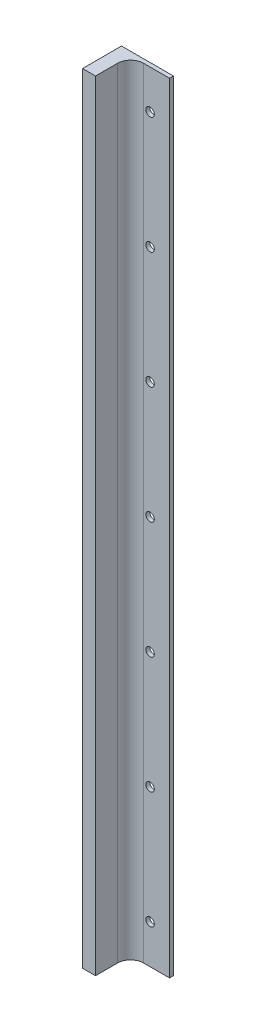
ISO-10303-21;
HEADER;
FILE_DESCRIPTION(('STEP AP214'),'2;1');
FILE_NAME('part.step','',(''),(''),'','','');
FILE_SCHEMA(('AUTOMOTIVE_DESIGN { 1 0 10303 214 1 1 1 1 }'));
ENDSEC;
DATA;
#1=APPLICATION_CONTEXT('core data for automotive mechanical design processes');
#2=APPLICATION_PROTOCOL_DEFINITION('international standard','automotive_design',2000,#1);
#3=PRODUCT_CONTEXT('',#1,'mechanical');
#4=PRODUCT('Part','Part','',(#3));
#5=PRODUCT_RELATED_PRODUCT_CATEGORY('part','',(#4));
#6=PRODUCT_DEFINITION_FORMATION('','',#4);
#7=PRODUCT_DEFINITION_CONTEXT('part definition',#1,'design');
#8=PRODUCT_DEFINITION('design','',#6,#7);
#9=PRODUCT_DEFINITION_SHAPE('','',#8);
#10=(LENGTH_UNIT() NAMED_UNIT(*) SI_UNIT(.MILLI.,.METRE.));
#11=(NAMED_UNIT(*) PLANE_ANGLE_UNIT() SI_UNIT($,.RADIAN.));
#12=(NAMED_UNIT(*) SI_UNIT($,.STERADIAN.) SOLID_ANGLE_UNIT());
#13=UNCERTAINTY_MEASURE_WITH_UNIT(LENGTH_MEASURE(1.E-05),#10,'distance_accuracy_value','');
#14=(GEOMETRIC_REPRESENTATION_CONTEXT(3) GLOBAL_UNCERTAINTY_ASSIGNED_CONTEXT((#13)) GLOBAL_UNIT_ASSIGNED_CONTEXT((#10,
#11,#12)) REPRESENTATION_CONTEXT('',''));
#15=CARTESIAN_POINT('',(0.,0.,0.));
#16=DIRECTION('',(0.,0.,1.));
#17=DIRECTION('',(1.,0.,0.));
#18=AXIS2_PLACEMENT_3D('',#15,#16,#17);
#19=CARTESIAN_POINT('',(0.,0.,3.));
#20=DIRECTION('',(0.,0.,1.));
#21=DIRECTION('',(1.,0.,0.));
#22=AXIS2_PLACEMENT_3D('',#19,#20,#21);
#23=PLANE('',#22);
#24=DIRECTION('',(-1.,0.,0.));
#25=VECTOR('',#24,1.);
#26=CARTESIAN_POINT('',(165.,300.,3.));
#27=LINE('',#26,#25);
#28=CARTESIAN_POINT('',(165.,300.,3.));
#29=VERTEX_POINT('',#28);
#30=CARTESIAN_POINT('',(145.,300.,3.));
#31=VERTEX_POINT('',#30);
#32=EDGE_CURVE('E168',#29,#31,#27,.T.);
#33=ORIENTED_EDGE('',*,*,#32,.T.);
#34=DIRECTION('',(0.,1.,0.));
#35=VECTOR('',#34,1.);
#36=CARTESIAN_POINT('',(145.,0.,3.));
#37=LINE('',#36,#35);
#38=CARTESIAN_POINT('',(145.,-300.,3.));
#39=VERTEX_POINT('',#38);
#40=EDGE_CURVE('E54',#31,#39,#37,.F.);
#41=ORIENTED_EDGE('',*,*,#40,.T.);
#42=DIRECTION('',(1.,0.,0.));
#43=VECTOR('',#42,1.);
#44=CARTESIAN_POINT('',(150.,-300.,3.));
#45=LINE('',#44,#43);
#46=CARTESIAN_POINT('',(165.,-300.,3.));
#47=VERTEX_POINT('',#46);
#48=EDGE_CURVE('E163',#39,#47,#45,.T.);
#49=ORIENTED_EDGE('',*,*,#48,.T.);
#50=DIRECTION('',(0.,1.,0.));
#51=VECTOR('',#50,1.);
#52=CARTESIAN_POINT('',(165.,-300.,3.));
#53=LINE('',#52,#51);
#54=EDGE_CURVE('E165',#47,#29,#53,.T.);
#55=ORIENTED_EDGE('',*,*,#54,.T.);
#56=EDGE_LOOP('',(#33,#41,#49,#55));
#57=FACE_BOUND('',#56,.T.);
#58=CARTESIAN_POINT('',(149.999999999999,-180.,3.));
#59=DIRECTION('',(0.,0.,1.));
#60=DIRECTION('',(1.,0.,0.));
#61=AXIS2_PLACEMENT_3D('',#58,#59,#60);
#62=CIRCLE('',#61,3.25000000000001);
#63=CARTESIAN_POINT('',(153.249999999999,-180.,3.));
#64=VERTEX_POINT('',#63);
#65=EDGE_CURVE('E127',#64,#64,#62,.T.);
#66=ORIENTED_EDGE('',*,*,#65,.F.);
#67=EDGE_LOOP('',(#66));
#68=FACE_BOUND('',#67,.T.);
#69=CARTESIAN_POINT('',(149.999999999998,0.,3.));
#70=DIRECTION('',(0.,0.,1.));
#71=DIRECTION('',(1.,0.,0.));
#72=AXIS2_PLACEMENT_3D('',#69,#70,#71);
#73=CIRCLE('',#72,3.25000000000001);
#74=CARTESIAN_POINT('',(153.249999999998,0.,3.));
#75=VERTEX_POINT('',#74);
#76=EDGE_CURVE('E139',#75,#75,#73,.T.);
#77=ORIENTED_EDGE('',*,*,#76,.F.);
#78=EDGE_LOOP('',(#77));
#79=FACE_BOUND('',#78,.T.);
#80=CARTESIAN_POINT('',(149.999999999998,180.,3.));
#81=DIRECTION('',(0.,0.,1.));
#82=DIRECTION('',(1.,0.,0.));
#83=AXIS2_PLACEMENT_3D('',#80,#81,#82);
#84=CIRCLE('',#83,3.25000000000001);
#85=CARTESIAN_POINT('',(153.249999999998,180.,3.));
#86=VERTEX_POINT('',#85);
#87=EDGE_CURVE('E151',#86,#86,#84,.T.);
#88=ORIENTED_EDGE('',*,*,#87,.F.);
#89=EDGE_LOOP('',(#88));
#90=FACE_BOUND('',#89,.T.);
#91=CARTESIAN_POINT('',(149.999999999998,270.,3.));
#92=DIRECTION('',(0.,0.,1.));
#93=DIRECTION('',(1.,0.,0.));
#94=AXIS2_PLACEMENT_3D('',#91,#92,#93);
#95=CIRCLE('',#94,3.25000000000001);
#96=CARTESIAN_POINT('',(153.249999999998,270.,3.));
#97=VERTEX_POINT('',#96);
#98=EDGE_CURVE('E157',#97,#97,#95,.T.);
#99=ORIENTED_EDGE('',*,*,#98,.F.);
#100=EDGE_LOOP('',(#99));
#101=FACE_BOUND('',#100,.T.);
#102=CARTESIAN_POINT('',(149.999999999999,90.,3.));
#103=DIRECTION('',(0.,0.,1.));
#104=DIRECTION('',(1.,0.,0.));
#105=AXIS2_PLACEMENT_3D('',#102,#103,#104);
#106=CIRCLE('',#105,3.25000000000001);
#107=CARTESIAN_POINT('',(153.249999999999,90.,3.));
#108=VERTEX_POINT('',#107);
#109=EDGE_CURVE('E145',#108,#108,#106,.T.);
#110=ORIENTED_EDGE('',*,*,#109,.F.);
#111=EDGE_LOOP('',(#110));
#112=FACE_BOUND('',#111,.T.);
#113=CARTESIAN_POINT('',(149.999999999999,-90.,3.));
#114=DIRECTION('',(0.,0.,1.));
#115=DIRECTION('',(1.,0.,0.));
#116=AXIS2_PLACEMENT_3D('',#113,#114,#115);
#117=CIRCLE('',#116,3.25000000000001);
#118=CARTESIAN_POINT('',(153.249999999999,-90.,3.));
#119=VERTEX_POINT('',#118);
#120=EDGE_CURVE('E133',#119,#119,#117,.T.);
#121=ORIENTED_EDGE('',*,*,#120,.F.);
#122=EDGE_LOOP('',(#121));
#123=FACE_BOUND('',#122,.T.);
#124=CARTESIAN_POINT('',(150.,-270.,3.));
#125=DIRECTION('',(0.,0.,1.));
#126=DIRECTION('',(1.,0.,0.));
#127=AXIS2_PLACEMENT_3D('',#124,#125,#126);
#128=CIRCLE('',#127,3.25000000000001);
#129=CARTESIAN_POINT('',(153.25,-270.,3.));
#130=VERTEX_POINT('',#129);
#131=EDGE_CURVE('E118',#130,#130,#128,.T.);
#132=ORIENTED_EDGE('',*,*,#131,.F.);
#133=EDGE_LOOP('',(#132));
#134=FACE_BOUND('',#133,.T.);
#135=ADVANCED_FACE('F33',(#57,#68,#79,#90,#101,#112,#123,#134),#23,.T.);
#136=CARTESIAN_POINT('',(0.,0.,0.));
#137=DIRECTION('',(0.,0.,1.));
#138=DIRECTION('',(1.,0.,0.));
#139=AXIS2_PLACEMENT_3D('',#136,#137,#138);
#140=PLANE('',#139);
#141=DIRECTION('',(0.,1.,0.));
#142=VECTOR('',#141,1.);
#143=CARTESIAN_POINT('',(165.,-300.,0.));
#144=LINE('',#143,#142);
#145=CARTESIAN_POINT('',(165.,-300.,0.));
#146=VERTEX_POINT('',#145);
#147=CARTESIAN_POINT('',(165.,300.,0.));
#148=VERTEX_POINT('',#147);
#149=EDGE_CURVE('E160',#146,#148,#144,.T.);
#150=ORIENTED_EDGE('',*,*,#149,.F.);
#151=DIRECTION('',(1.,0.,0.));
#152=VECTOR('',#151,1.);
#153=CARTESIAN_POINT('',(150.,-300.,0.));
#154=LINE('',#153,#152);
#155=CARTESIAN_POINT('',(125.,-300.,0.));
#156=VERTEX_POINT('',#155);
#157=EDGE_CURVE('E166',#156,#146,#154,.T.);
#158=ORIENTED_EDGE('',*,*,#157,.F.);
#159=DIRECTION('',(0.,-1.,0.));
#160=VECTOR('',#159,1.);
#161=CARTESIAN_POINT('',(125.,-300.,0.));
#162=LINE('',#161,#160);
#163=CARTESIAN_POINT('',(125.,300.,0.));
#164=VERTEX_POINT('',#163);
#165=EDGE_CURVE('E174',#164,#156,#162,.T.);
#166=ORIENTED_EDGE('',*,*,#165,.F.);
#167=DIRECTION('',(-1.,0.,0.));
#168=VECTOR('',#167,1.);
#169=CARTESIAN_POINT('',(165.,300.,0.));
#170=LINE('',#169,#168);
#171=EDGE_CURVE('E172',#148,#164,#170,.T.);
#172=ORIENTED_EDGE('',*,*,#171,.F.);
#173=EDGE_LOOP('',(#150,#158,#166,#172));
#174=FACE_BOUND('',#173,.T.);
#175=CARTESIAN_POINT('',(149.999999999998,270.,0.));
#176=DIRECTION('',(0.,0.,1.));
#177=DIRECTION('',(1.,0.,0.));
#178=AXIS2_PLACEMENT_3D('',#175,#176,#177);
#179=CIRCLE('',#178,3.25000000000001);
#180=CARTESIAN_POINT('',(153.249999999998,270.,0.));
#181=VERTEX_POINT('',#180);
#182=EDGE_CURVE('E154',#181,#181,#179,.T.);
#183=ORIENTED_EDGE('',*,*,#182,.T.);
#184=EDGE_LOOP('',(#183));
#185=FACE_BOUND('',#184,.T.);
#186=CARTESIAN_POINT('',(149.999999999998,180.,0.));
#187=DIRECTION('',(0.,0.,1.));
#188=DIRECTION('',(1.,0.,0.));
#189=AXIS2_PLACEMENT_3D('',#186,#187,#188);
#190=CIRCLE('',#189,3.25000000000001);
#191=CARTESIAN_POINT('',(153.249999999998,180.,0.));
#192=VERTEX_POINT('',#191);
#193=EDGE_CURVE('E148',#192,#192,#190,.T.);
#194=ORIENTED_EDGE('',*,*,#193,.T.);
#195=EDGE_LOOP('',(#194));
#196=FACE_BOUND('',#195,.T.);
#197=CARTESIAN_POINT('',(149.999999999999,90.,0.));
#198=DIRECTION('',(0.,0.,1.));
#199=DIRECTION('',(1.,0.,0.));
#200=AXIS2_PLACEMENT_3D('',#197,#198,#199);
#201=CIRCLE('',#200,3.25000000000001);
#202=CARTESIAN_POINT('',(153.249999999999,90.,0.));
#203=VERTEX_POINT('',#202);
#204=EDGE_CURVE('E142',#203,#203,#201,.T.);
#205=ORIENTED_EDGE('',*,*,#204,.T.);
#206=EDGE_LOOP('',(#205));
#207=FACE_BOUND('',#206,.T.);
#208=CARTESIAN_POINT('',(149.999999999998,0.,0.));
#209=DIRECTION('',(0.,0.,1.));
#210=DIRECTION('',(1.,0.,0.));
#211=AXIS2_PLACEMENT_3D('',#208,#209,#210);
#212=CIRCLE('',#211,3.25000000000001);
#213=CARTESIAN_POINT('',(153.249999999998,0.,0.));
#214=VERTEX_POINT('',#213);
#215=EDGE_CURVE('E136',#214,#214,#212,.T.);
#216=ORIENTED_EDGE('',*,*,#215,.T.);
#217=EDGE_LOOP('',(#216));
#218=FACE_BOUND('',#217,.T.);
#219=CARTESIAN_POINT('',(149.999999999999,-90.,0.));
#220=DIRECTION('',(0.,0.,1.));
#221=DIRECTION('',(1.,0.,0.));
#222=AXIS2_PLACEMENT_3D('',#219,#220,#221);
#223=CIRCLE('',#222,3.25000000000001);
#224=CARTESIAN_POINT('',(153.249999999999,-90.,0.));
#225=VERTEX_POINT('',#224);
#226=EDGE_CURVE('E130',#225,#225,#223,.T.);
#227=ORIENTED_EDGE('',*,*,#226,.T.);
#228=EDGE_LOOP('',(#227));
#229=FACE_BOUND('',#228,.T.);
#230=CARTESIAN_POINT('',(149.999999999999,-180.,0.));
#231=DIRECTION('',(0.,0.,1.));
#232=DIRECTION('',(1.,0.,0.));
#233=AXIS2_PLACEMENT_3D('',#230,#231,#232);
#234=CIRCLE('',#233,3.25000000000001);
#235=CARTESIAN_POINT('',(153.249999999999,-180.,0.));
#236=VERTEX_POINT('',#235);
#237=EDGE_CURVE('E125',#236,#236,#234,.T.);
#238=ORIENTED_EDGE('',*,*,#237,.T.);
#239=EDGE_LOOP('',(#238));
#240=FACE_BOUND('',#239,.T.);
#241=CARTESIAN_POINT('',(150.,-270.,0.));
#242=DIRECTION('',(0.,0.,1.));
#243=DIRECTION('',(1.,0.,0.));
#244=AXIS2_PLACEMENT_3D('',#241,#242,#243);
#245=CIRCLE('',#244,3.25000000000001);
#246=CARTESIAN_POINT('',(153.25,-270.,0.));
#247=VERTEX_POINT('',#246);
#248=EDGE_CURVE('E115',#247,#247,#245,.T.);
#249=ORIENTED_EDGE('',*,*,#248,.T.);
#250=EDGE_LOOP('',(#249));
#251=FACE_BOUND('',#250,.T.);
#252=ADVANCED_FACE('F200',(#174,#185,#196,#207,#218,#229,#240,#251),#140,.F.);
#253=CARTESIAN_POINT('',(165.,-300.,3.));
#254=DIRECTION('',(-1.,0.,0.));
#255=DIRECTION('',(0.,-1.,0.));
#256=AXIS2_PLACEMENT_3D('',#253,#254,#255);
#257=PLANE('',#256);
#258=ORIENTED_EDGE('',*,*,#149,.T.);
#259=DIRECTION('',(0.,0.,-1.));
#260=VECTOR('',#259,1.);
#261=CARTESIAN_POINT('',(165.,300.,3.));
#262=LINE('',#261,#260);
#263=EDGE_CURVE('E180',#29,#148,#262,.T.);
#264=ORIENTED_EDGE('',*,*,#263,.F.);
#265=ORIENTED_EDGE('',*,*,#54,.F.);
#266=DIRECTION('',(0.,0.,-1.));
#267=VECTOR('',#266,1.);
#268=CARTESIAN_POINT('',(165.,-300.,3.));
#269=LINE('',#268,#267);
#270=EDGE_CURVE('E183',#47,#146,#269,.T.);
#271=ORIENTED_EDGE('',*,*,#270,.T.);
#272=EDGE_LOOP('',(#258,#264,#265,#271));
#273=FACE_BOUND('',#272,.T.);
#274=ADVANCED_FACE('F190',(#273),#257,.F.);
#275=CARTESIAN_POINT('',(165.,300.,3.));
#276=DIRECTION('',(0.,-1.,0.));
#277=DIRECTION('',(0.,0.,-1.));
#278=AXIS2_PLACEMENT_3D('',#275,#276,#277);
#279=PLANE('',#278);
#280=ORIENTED_EDGE('',*,*,#171,.T.);
#281=DIRECTION('',(0.,0.,-1.));
#282=VECTOR('',#281,1.);
#283=CARTESIAN_POINT('',(125.,300.,3.));
#284=LINE('',#283,#282);
#285=CARTESIAN_POINT('',(125.,300.,30.));
#286=VERTEX_POINT('',#285);
#287=EDGE_CURVE('E105',#286,#164,#284,.T.);
#288=ORIENTED_EDGE('',*,*,#287,.F.);
#289=DIRECTION('',(-1.,0.,0.));
#290=VECTOR('',#289,1.);
#291=CARTESIAN_POINT('',(125.,300.,30.));
#292=LINE('',#291,#290);
#293=CARTESIAN_POINT('',(135.,300.,30.));
#294=VERTEX_POINT('',#293);
#295=EDGE_CURVE('E99',#294,#286,#292,.T.);
#296=ORIENTED_EDGE('',*,*,#295,.F.);
#297=DIRECTION('',(0.,0.,-1.));
#298=VECTOR('',#297,1.);
#299=CARTESIAN_POINT('',(135.,300.,630.0833275471));
#300=LINE('',#299,#298);
#301=CARTESIAN_POINT('',(135.,300.,13.));
#302=VERTEX_POINT('',#301);
#303=EDGE_CURVE('E90',#294,#302,#300,.T.);
#304=ORIENTED_EDGE('',*,*,#303,.T.);
#305=CARTESIAN_POINT('',(145.,300.,13.));
#306=DIRECTION('',(0.,-1.,0.));
#307=DIRECTION('',(0.,0.,-1.));
#308=AXIS2_PLACEMENT_3D('',#305,#306,#307);
#309=CIRCLE('',#308,10.);
#310=EDGE_CURVE('E41',#302,#31,#309,.T.);
#311=ORIENTED_EDGE('',*,*,#310,.T.);
#312=ORIENTED_EDGE('',*,*,#32,.F.);
#313=ORIENTED_EDGE('',*,*,#263,.T.);
#314=EDGE_LOOP('',(#280,#288,#296,#304,#311,#312,#313));
#315=FACE_BOUND('',#314,.T.);
#316=ADVANCED_FACE('F103',(#315),#279,.F.);
#317=CARTESIAN_POINT('',(125.,-300.,3.));
#318=DIRECTION('',(1.,0.,0.));
#319=DIRECTION('',(0.,1.,0.));
#320=AXIS2_PLACEMENT_3D('',#317,#318,#319);
#321=PLANE('',#320);
#322=ORIENTED_EDGE('',*,*,#165,.T.);
#323=DIRECTION('',(0.,0.,-1.));
#324=VECTOR('',#323,1.);
#325=CARTESIAN_POINT('',(125.,-300.,3.));
#326=LINE('',#325,#324);
#327=CARTESIAN_POINT('',(125.,-300.,30.));
#328=VERTEX_POINT('',#327);
#329=EDGE_CURVE('E170',#328,#156,#326,.T.);
#330=ORIENTED_EDGE('',*,*,#329,.F.);
#331=DIRECTION('',(0.,-1.,0.));
#332=VECTOR('',#331,1.);
#333=CARTESIAN_POINT('',(125.,-300.,30.));
#334=LINE('',#333,#332);
#335=EDGE_CURVE('E109',#286,#328,#334,.T.);
#336=ORIENTED_EDGE('',*,*,#335,.F.);
#337=ORIENTED_EDGE('',*,*,#287,.T.);
#338=EDGE_LOOP('',(#322,#330,#336,#337));
#339=FACE_BOUND('',#338,.T.);
#340=ADVANCED_FACE('F203',(#339),#321,.F.);
#341=CARTESIAN_POINT('',(150.,-300.,3.));
#342=DIRECTION('',(0.,1.,0.));
#343=DIRECTION('',(0.,0.,1.));
#344=AXIS2_PLACEMENT_3D('',#341,#342,#343);
#345=PLANE('',#344);
#346=ORIENTED_EDGE('',*,*,#157,.T.);
#347=ORIENTED_EDGE('',*,*,#270,.F.);
#348=ORIENTED_EDGE('',*,*,#48,.F.);
#349=CARTESIAN_POINT('',(145.,-300.,13.));
#350=DIRECTION('',(0.,1.,0.));
#351=DIRECTION('',(0.,0.,1.));
#352=AXIS2_PLACEMENT_3D('',#349,#350,#351);
#353=CIRCLE('',#352,10.);
#354=CARTESIAN_POINT('',(135.,-300.,13.));
#355=VERTEX_POINT('',#354);
#356=EDGE_CURVE('E11',#39,#355,#353,.T.);
#357=ORIENTED_EDGE('',*,*,#356,.T.);
#358=DIRECTION('',(0.,0.,-1.));
#359=VECTOR('',#358,1.);
#360=CARTESIAN_POINT('',(135.,-300.,630.0833275471));
#361=LINE('',#360,#359);
#362=CARTESIAN_POINT('',(135.,-300.,30.));
#363=VERTEX_POINT('',#362);
#364=EDGE_CURVE('E100',#363,#355,#361,.T.);
#365=ORIENTED_EDGE('',*,*,#364,.F.);
#366=DIRECTION('',(1.,0.,0.));
#367=VECTOR('',#366,1.);
#368=CARTESIAN_POINT('',(125.,-300.,30.));
#369=LINE('',#368,#367);
#370=EDGE_CURVE('E114',#328,#363,#369,.T.);
#371=ORIENTED_EDGE('',*,*,#370,.F.);
#372=ORIENTED_EDGE('',*,*,#329,.T.);
#373=EDGE_LOOP('',(#346,#347,#348,#357,#365,#371,#372));
#374=FACE_BOUND('',#373,.T.);
#375=ADVANCED_FACE('F194',(#374),#345,.F.);
#376=CARTESIAN_POINT('',(149.999999999998,270.,3.));
#377=DIRECTION('',(0.,0.,-1.));
#378=DIRECTION('',(-1.,0.,0.));
#379=AXIS2_PLACEMENT_3D('',#376,#377,#378);
#380=CYLINDRICAL_SURFACE('',#379,3.25000000000001);
#381=ORIENTED_EDGE('',*,*,#98,.T.);
#382=EDGE_LOOP('',(#381));
#383=FACE_BOUND('',#382,.T.);
#384=ORIENTED_EDGE('',*,*,#182,.F.);
#385=EDGE_LOOP('',(#384));
#386=FACE_BOUND('',#385,.T.);
#387=ADVANCED_FACE('F218',(#383,#386),#380,.F.);
#388=CARTESIAN_POINT('',(149.999999999998,180.,3.));
#389=DIRECTION('',(0.,0.,-1.));
#390=DIRECTION('',(-1.,0.,0.));
#391=AXIS2_PLACEMENT_3D('',#388,#389,#390);
#392=CYLINDRICAL_SURFACE('',#391,3.25000000000001);
#393=ORIENTED_EDGE('',*,*,#87,.T.);
#394=EDGE_LOOP('',(#393));
#395=FACE_BOUND('',#394,.T.);
#396=ORIENTED_EDGE('',*,*,#193,.F.);
#397=EDGE_LOOP('',(#396));
#398=FACE_BOUND('',#397,.T.);
#399=ADVANCED_FACE('F252',(#395,#398),#392,.F.);
#400=CARTESIAN_POINT('',(149.999999999999,90.,3.));
#401=DIRECTION('',(0.,0.,-1.));
#402=DIRECTION('',(-1.,0.,0.));
#403=AXIS2_PLACEMENT_3D('',#400,#401,#402);
#404=CYLINDRICAL_SURFACE('',#403,3.25000000000001);
#405=ORIENTED_EDGE('',*,*,#109,.T.);
#406=EDGE_LOOP('',(#405));
#407=FACE_BOUND('',#406,.T.);
#408=ORIENTED_EDGE('',*,*,#204,.F.);
#409=EDGE_LOOP('',(#408));
#410=FACE_BOUND('',#409,.T.);
#411=ADVANCED_FACE('F259',(#407,#410),#404,.F.);
#412=CARTESIAN_POINT('',(149.999999999998,0.,3.));
#413=DIRECTION('',(0.,0.,-1.));
#414=DIRECTION('',(-1.,0.,0.));
#415=AXIS2_PLACEMENT_3D('',#412,#413,#414);
#416=CYLINDRICAL_SURFACE('',#415,3.25000000000001);
#417=ORIENTED_EDGE('',*,*,#76,.T.);
#418=EDGE_LOOP('',(#417));
#419=FACE_BOUND('',#418,.T.);
#420=ORIENTED_EDGE('',*,*,#215,.F.);
#421=EDGE_LOOP('',(#420));
#422=FACE_BOUND('',#421,.T.);
#423=ADVANCED_FACE('F266',(#419,#422),#416,.F.);
#424=CARTESIAN_POINT('',(149.999999999999,-90.,3.));
#425=DIRECTION('',(0.,0.,-1.));
#426=DIRECTION('',(-1.,0.,0.));
#427=AXIS2_PLACEMENT_3D('',#424,#425,#426);
#428=CYLINDRICAL_SURFACE('',#427,3.25000000000001);
#429=ORIENTED_EDGE('',*,*,#120,.T.);
#430=EDGE_LOOP('',(#429));
#431=FACE_BOUND('',#430,.T.);
#432=ORIENTED_EDGE('',*,*,#226,.F.);
#433=EDGE_LOOP('',(#432));
#434=FACE_BOUND('',#433,.T.);
#435=ADVANCED_FACE('F274',(#431,#434),#428,.F.);
#436=CARTESIAN_POINT('',(149.999999999999,-180.,3.));
#437=DIRECTION('',(0.,0.,-1.));
#438=DIRECTION('',(-1.,0.,0.));
#439=AXIS2_PLACEMENT_3D('',#436,#437,#438);
#440=CYLINDRICAL_SURFACE('',#439,3.25000000000001);
#441=ORIENTED_EDGE('',*,*,#65,.T.);
#442=EDGE_LOOP('',(#441));
#443=FACE_BOUND('',#442,.T.);
#444=ORIENTED_EDGE('',*,*,#237,.F.);
#445=EDGE_LOOP('',(#444));
#446=FACE_BOUND('',#445,.T.);
#447=ADVANCED_FACE('F282',(#443,#446),#440,.F.);
#448=CARTESIAN_POINT('',(150.,-270.,3.));
#449=DIRECTION('',(0.,0.,-1.));
#450=DIRECTION('',(-1.,0.,0.));
#451=AXIS2_PLACEMENT_3D('',#448,#449,#450);
#452=CYLINDRICAL_SURFACE('',#451,3.25000000000001);
#453=ORIENTED_EDGE('',*,*,#131,.T.);
#454=EDGE_LOOP('',(#453));
#455=FACE_BOUND('',#454,.T.);
#456=ORIENTED_EDGE('',*,*,#248,.F.);
#457=EDGE_LOOP('',(#456));
#458=FACE_BOUND('',#457,.T.);
#459=ADVANCED_FACE('F290',(#455,#458),#452,.F.);
#460=CARTESIAN_POINT('',(135.,-300.,630.0833275471));
#461=DIRECTION('',(-1.,0.,0.));
#462=DIRECTION('',(0.,0.,1.));
#463=AXIS2_PLACEMENT_3D('',#460,#461,#462);
#464=PLANE('',#463);
#465=ORIENTED_EDGE('',*,*,#364,.T.);
#466=DIRECTION('',(0.,1.,0.));
#467=VECTOR('',#466,1.);
#468=CARTESIAN_POINT('',(135.,-300.,13.));
#469=LINE('',#468,#467);
#470=EDGE_CURVE('E98',#355,#302,#469,.T.);
#471=ORIENTED_EDGE('',*,*,#470,.T.);
#472=ORIENTED_EDGE('',*,*,#303,.F.);
#473=DIRECTION('',(0.,1.,0.));
#474=VECTOR('',#473,1.);
#475=CARTESIAN_POINT('',(135.,-300.,30.));
#476=LINE('',#475,#474);
#477=EDGE_CURVE('E95',#363,#294,#476,.T.);
#478=ORIENTED_EDGE('',*,*,#477,.F.);
#479=EDGE_LOOP('',(#465,#471,#472,#478));
#480=FACE_BOUND('',#479,.T.);
#481=ADVANCED_FACE('F93',(#480),#464,.F.);
#482=CARTESIAN_POINT('',(-1.38777878078145E-13,44.6898777778796,30.0000000000001));
#483=DIRECTION('',(0.,0.,1.));
#484=DIRECTION('',(1.,0.,0.));
#485=AXIS2_PLACEMENT_3D('',#482,#483,#484);
#486=PLANE('',#485);
#487=ORIENTED_EDGE('',*,*,#295,.T.);
#488=ORIENTED_EDGE('',*,*,#335,.T.);
#489=ORIENTED_EDGE('',*,*,#370,.T.);
#490=ORIENTED_EDGE('',*,*,#477,.T.);
#491=EDGE_LOOP('',(#487,#488,#489,#490));
#492=FACE_BOUND('',#491,.T.);
#493=ADVANCED_FACE('F112',(#492),#486,.T.);
#494=CARTESIAN_POINT('',(145.,-300.,13.));
#495=DIRECTION('',(0.,1.,0.));
#496=DIRECTION('',(0.,0.,1.));
#497=AXIS2_PLACEMENT_3D('',#494,#495,#496);
#498=CYLINDRICAL_SURFACE('',#497,10.);
#499=ORIENTED_EDGE('',*,*,#356,.F.);
#500=ORIENTED_EDGE('',*,*,#40,.F.);
#501=ORIENTED_EDGE('',*,*,#310,.F.);
#502=ORIENTED_EDGE('',*,*,#470,.F.);
#503=EDGE_LOOP('',(#499,#500,#501,#502));
#504=FACE_BOUND('',#503,.T.);
#505=ADVANCED_FACE('F35',(#504),#498,.F.);
#506=CLOSED_SHELL('',(#135,#252,#274,#316,#340,#375,#387,#399,#411,#423,#435,#447,#459,#481,
#493,#505));
#507=MANIFOLD_SOLID_BREP('B2',#506);
#508=ADVANCED_BREP_SHAPE_REPRESENTATION('',(#18,#507),#14);
#509=SHAPE_DEFINITION_REPRESENTATION(#9,#508);
ENDSEC;
END-ISO-10303-21;
